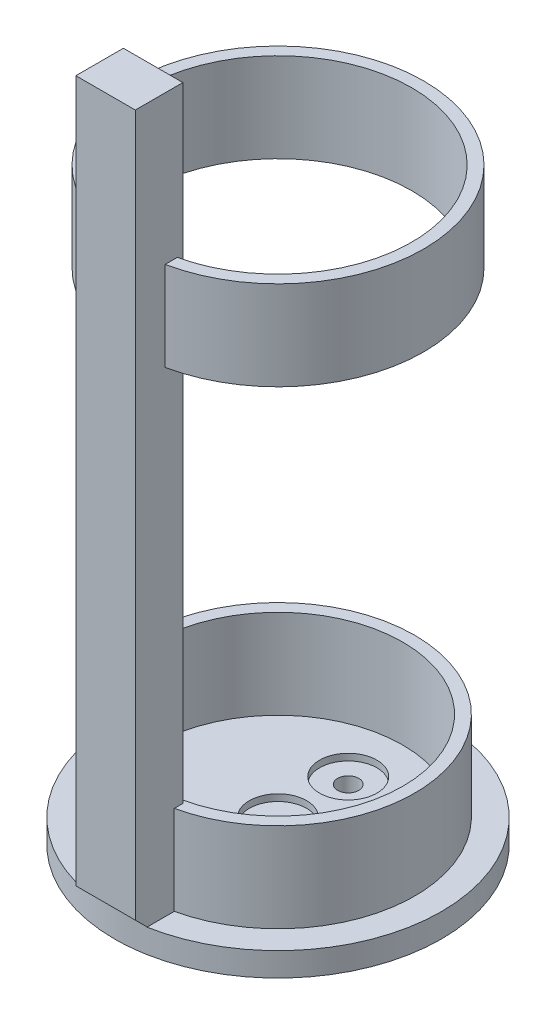
ISO-10303-21;
HEADER;
FILE_DESCRIPTION(('STEP AP214'),'2;1');
FILE_NAME('part.step','',(''),(''),'','','');
FILE_SCHEMA(('AUTOMOTIVE_DESIGN { 1 0 10303 214 1 1 1 1 }'));
ENDSEC;
DATA;
#1=APPLICATION_CONTEXT('core data for automotive mechanical design processes');
#2=APPLICATION_PROTOCOL_DEFINITION('international standard','automotive_design',2000,#1);
#3=PRODUCT_CONTEXT('',#1,'mechanical');
#4=PRODUCT('Part','Part','',(#3));
#5=PRODUCT_RELATED_PRODUCT_CATEGORY('part','',(#4));
#6=PRODUCT_DEFINITION_FORMATION('','',#4);
#7=PRODUCT_DEFINITION_CONTEXT('part definition',#1,'design');
#8=PRODUCT_DEFINITION('design','',#6,#7);
#9=PRODUCT_DEFINITION_SHAPE('','',#8);
#10=(LENGTH_UNIT() NAMED_UNIT(*) SI_UNIT(.MILLI.,.METRE.));
#11=(NAMED_UNIT(*) PLANE_ANGLE_UNIT() SI_UNIT($,.RADIAN.));
#12=(NAMED_UNIT(*) SI_UNIT($,.STERADIAN.) SOLID_ANGLE_UNIT());
#13=UNCERTAINTY_MEASURE_WITH_UNIT(LENGTH_MEASURE(1.E-05),#10,'distance_accuracy_value','');
#14=(GEOMETRIC_REPRESENTATION_CONTEXT(3) GLOBAL_UNCERTAINTY_ASSIGNED_CONTEXT((#13)) GLOBAL_UNIT_ASSIGNED_CONTEXT((#10,
#11,#12)) REPRESENTATION_CONTEXT('',''));
#15=CARTESIAN_POINT('',(0.,0.,0.));
#16=DIRECTION('',(0.,0.,1.));
#17=DIRECTION('',(1.,0.,0.));
#18=AXIS2_PLACEMENT_3D('',#15,#16,#17);
#19=CARTESIAN_POINT('',(-6.35000000000005,157.48,26.67));
#20=DIRECTION('',(1.,0.,0.));
#21=DIRECTION('',(0.,0.,-1.));
#22=AXIS2_PLACEMENT_3D('',#19,#20,#21);
#23=PLANE('',#22);
#24=DIRECTION('',(0.,0.,1.));
#25=VECTOR('',#24,1.);
#26=CARTESIAN_POINT('',(-6.35000000000005,5.08,26.67));
#27=LINE('',#26,#25);
#28=CARTESIAN_POINT('',(-6.35000000000005,5.08,28.5114292872174));
#29=VERTEX_POINT('',#28);
#30=CARTESIAN_POINT('',(-6.35000000000004,5.08,34.3428758987945));
#31=VERTEX_POINT('',#30);
#32=EDGE_CURVE('E242',#29,#31,#27,.T.);
#33=ORIENTED_EDGE('',*,*,#32,.T.);
#34=DIRECTION('',(0.,-1.,0.));
#35=VECTOR('',#34,1.);
#36=CARTESIAN_POINT('',(-6.35000000000004,5.08,34.3428758987945));
#37=LINE('',#36,#35);
#38=CARTESIAN_POINT('',(-6.35000000000005,5.13287589879451,34.3428758987945));
#39=VERTEX_POINT('',#38);
#40=EDGE_CURVE('E162',#39,#31,#37,.T.);
#41=ORIENTED_EDGE('',*,*,#40,.F.);
#42=DIRECTION('',(0.,-0.707106781186551,-0.707106781186545));
#43=VECTOR('',#42,1.);
#44=CARTESIAN_POINT('',(-6.35000000000005,7.62000000000004,36.83));
#45=LINE('',#44,#43);
#46=CARTESIAN_POINT('',(-6.35000000000005,7.6200000000001,36.83));
#47=VERTEX_POINT('',#46);
#48=EDGE_CURVE('E191',#39,#47,#45,.F.);
#49=ORIENTED_EDGE('',*,*,#48,.T.);
#50=DIRECTION('',(0.,-1.,0.));
#51=VECTOR('',#50,1.);
#52=CARTESIAN_POINT('',(-6.35000000000005,157.48,36.83));
#53=LINE('',#52,#51);
#54=CARTESIAN_POINT('',(-6.35000000000005,157.48,36.83));
#55=VERTEX_POINT('',#54);
#56=EDGE_CURVE('E221',#55,#47,#53,.T.);
#57=ORIENTED_EDGE('',*,*,#56,.F.);
#58=DIRECTION('',(0.,0.,1.));
#59=VECTOR('',#58,1.);
#60=CARTESIAN_POINT('',(-6.35000000000005,157.48,26.67));
#61=LINE('',#60,#59);
#62=CARTESIAN_POINT('',(-6.35000000000005,157.48,26.67));
#63=VERTEX_POINT('',#62);
#64=EDGE_CURVE('E246',#63,#55,#61,.T.);
#65=ORIENTED_EDGE('',*,*,#64,.F.);
#66=DIRECTION('',(0.,-1.,0.));
#67=VECTOR('',#66,1.);
#68=CARTESIAN_POINT('',(-6.35000000000005,157.48,26.67));
#69=LINE('',#68,#67);
#70=CARTESIAN_POINT('',(-6.35000000000005,24.1300000000001,26.67));
#71=VERTEX_POINT('',#70);
#72=EDGE_CURVE('E235',#63,#71,#69,.T.);
#73=ORIENTED_EDGE('',*,*,#72,.T.);
#74=DIRECTION('',(0.,0.,1.));
#75=VECTOR('',#74,1.);
#76=CARTESIAN_POINT('',(-6.35000000000005,24.13,26.67));
#77=LINE('',#76,#75);
#78=CARTESIAN_POINT('',(-6.35000000000005,24.13,28.5114292872174));
#79=VERTEX_POINT('',#78);
#80=EDGE_CURVE('E261',#71,#79,#77,.T.);
#81=ORIENTED_EDGE('',*,*,#80,.T.);
#82=DIRECTION('',(0.,-1.,0.));
#83=VECTOR('',#82,1.);
#84=CARTESIAN_POINT('',(-6.35000000000004,24.13,28.5114292872174));
#85=LINE('',#84,#83);
#86=EDGE_CURVE('E247',#29,#79,#85,.F.);
#87=ORIENTED_EDGE('',*,*,#86,.F.);
#88=EDGE_LOOP('',(#33,#41,#49,#57,#65,#73,#81,#87));
#89=FACE_BOUND('',#88,.T.);
#90=DIRECTION('',(0.,-1.,0.));
#91=VECTOR('',#90,1.);
#92=CARTESIAN_POINT('',(-6.35000000000004,125.73,30.4601497862371));
#93=LINE('',#92,#91);
#94=CARTESIAN_POINT('',(-6.35000000000004,106.68,30.4601497862371));
#95=VERTEX_POINT('',#94);
#96=CARTESIAN_POINT('',(-6.35000000000004,125.73,30.4601497862371));
#97=VERTEX_POINT('',#96);
#98=EDGE_CURVE('E333',#95,#97,#93,.F.);
#99=ORIENTED_EDGE('',*,*,#98,.F.);
#100=DIRECTION('',(0.,0.,1.));
#101=VECTOR('',#100,1.);
#102=CARTESIAN_POINT('',(-6.35000000000005,106.68,26.67));
#103=LINE('',#102,#101);
#104=CARTESIAN_POINT('',(-6.35000000000004,106.68,27.86051192997));
#105=VERTEX_POINT('',#104);
#106=EDGE_CURVE('E330',#105,#95,#103,.T.);
#107=ORIENTED_EDGE('',*,*,#106,.F.);
#108=DIRECTION('',(0.,-1.,0.));
#109=VECTOR('',#108,1.);
#110=CARTESIAN_POINT('',(-6.35000000000004,125.73,27.86051192997));
#111=LINE('',#110,#109);
#112=CARTESIAN_POINT('',(-6.35000000000004,125.73,27.86051192997));
#113=VERTEX_POINT('',#112);
#114=EDGE_CURVE('E336',#105,#113,#111,.F.);
#115=ORIENTED_EDGE('',*,*,#114,.T.);
#116=DIRECTION('',(0.,0.,1.));
#117=VECTOR('',#116,1.);
#118=CARTESIAN_POINT('',(-6.35000000000005,125.73,26.67));
#119=LINE('',#118,#117);
#120=EDGE_CURVE('E169',#113,#97,#119,.T.);
#121=ORIENTED_EDGE('',*,*,#120,.T.);
#122=EDGE_LOOP('',(#99,#107,#115,#121));
#123=FACE_BOUND('',#122,.T.);
#124=ADVANCED_FACE('F65',(#89,#123),#23,.F.);
#125=CARTESIAN_POINT('',(6.34999999999995,157.48,26.67));
#126=DIRECTION('',(-1.,0.,0.));
#127=DIRECTION('',(0.,0.,1.));
#128=AXIS2_PLACEMENT_3D('',#125,#126,#127);
#129=PLANE('',#128);
#130=DIRECTION('',(0.,-1.,0.));
#131=VECTOR('',#130,1.);
#132=CARTESIAN_POINT('',(6.35000000000005,157.48,36.83));
#133=LINE('',#132,#131);
#134=CARTESIAN_POINT('',(6.35000000000005,157.48,36.83));
#135=VERTEX_POINT('',#134);
#136=CARTESIAN_POINT('',(6.35000000000005,7.6200000000001,36.83));
#137=VERTEX_POINT('',#136);
#138=EDGE_CURVE('E227',#135,#137,#133,.T.);
#139=ORIENTED_EDGE('',*,*,#138,.T.);
#140=DIRECTION('',(0.,0.707106781186551,0.707106781186545));
#141=VECTOR('',#140,1.);
#142=CARTESIAN_POINT('',(6.35000000000005,7.61999999999998,36.8299999999999));
#143=LINE('',#142,#141);
#144=CARTESIAN_POINT('',(6.35000000000003,5.13287589879451,34.3428758987945));
#145=VERTEX_POINT('',#144);
#146=EDGE_CURVE('E194',#137,#145,#143,.F.);
#147=ORIENTED_EDGE('',*,*,#146,.T.);
#148=DIRECTION('',(0.,-1.,0.));
#149=VECTOR('',#148,1.);
#150=CARTESIAN_POINT('',(6.35000000000002,5.08,34.3428758987945));
#151=LINE('',#150,#149);
#152=CARTESIAN_POINT('',(6.35000000000003,5.08,34.3428758987945));
#153=VERTEX_POINT('',#152);
#154=EDGE_CURVE('E183',#145,#153,#151,.T.);
#155=ORIENTED_EDGE('',*,*,#154,.T.);
#156=DIRECTION('',(0.,0.,-1.));
#157=VECTOR('',#156,1.);
#158=CARTESIAN_POINT('',(6.34999999999995,5.08,26.67));
#159=LINE('',#158,#157);
#160=CARTESIAN_POINT('',(6.34999999999997,5.08,28.5114292872174));
#161=VERTEX_POINT('',#160);
#162=EDGE_CURVE('E215',#153,#161,#159,.T.);
#163=ORIENTED_EDGE('',*,*,#162,.T.);
#164=DIRECTION('',(0.,-1.,0.));
#165=VECTOR('',#164,1.);
#166=CARTESIAN_POINT('',(6.34999999999997,24.13,28.5114292872174));
#167=LINE('',#166,#165);
#168=CARTESIAN_POINT('',(6.34999999999997,24.13,28.5114292872174));
#169=VERTEX_POINT('',#168);
#170=EDGE_CURVE('E206',#169,#161,#167,.T.);
#171=ORIENTED_EDGE('',*,*,#170,.F.);
#172=DIRECTION('',(0.,0.,-1.));
#173=VECTOR('',#172,1.);
#174=CARTESIAN_POINT('',(6.34999999999995,24.13,26.67));
#175=LINE('',#174,#173);
#176=CARTESIAN_POINT('',(6.34999999999995,24.13,26.67));
#177=VERTEX_POINT('',#176);
#178=EDGE_CURVE('E265',#169,#177,#175,.T.);
#179=ORIENTED_EDGE('',*,*,#178,.T.);
#180=DIRECTION('',(0.,-1.,0.));
#181=VECTOR('',#180,1.);
#182=CARTESIAN_POINT('',(6.34999999999995,157.48,26.67));
#183=LINE('',#182,#181);
#184=CARTESIAN_POINT('',(6.34999999999995,157.48,26.67));
#185=VERTEX_POINT('',#184);
#186=EDGE_CURVE('E231',#185,#177,#183,.T.);
#187=ORIENTED_EDGE('',*,*,#186,.F.);
#188=DIRECTION('',(0.,0.,-1.));
#189=VECTOR('',#188,1.);
#190=CARTESIAN_POINT('',(6.34999999999995,157.48,26.67));
#191=LINE('',#190,#189);
#192=EDGE_CURVE('E250',#135,#185,#191,.T.);
#193=ORIENTED_EDGE('',*,*,#192,.F.);
#194=EDGE_LOOP('',(#139,#147,#155,#163,#171,#179,#187,#193));
#195=FACE_BOUND('',#194,.T.);
#196=DIRECTION('',(0.,-1.,0.));
#197=VECTOR('',#196,1.);
#198=CARTESIAN_POINT('',(6.34999999999999,125.73,30.4601497862371));
#199=LINE('',#198,#197);
#200=CARTESIAN_POINT('',(6.34999999999999,125.73,30.4601497862371));
#201=VERTEX_POINT('',#200);
#202=CARTESIAN_POINT('',(6.34999999999999,106.68,30.4601497862371));
#203=VERTEX_POINT('',#202);
#204=EDGE_CURVE('E13',#201,#203,#199,.T.);
#205=ORIENTED_EDGE('',*,*,#204,.F.);
#206=DIRECTION('',(0.,0.,-1.));
#207=VECTOR('',#206,1.);
#208=CARTESIAN_POINT('',(6.34999999999995,125.73,26.67));
#209=LINE('',#208,#207);
#210=CARTESIAN_POINT('',(6.34999999999997,125.73,27.86051192997));
#211=VERTEX_POINT('',#210);
#212=EDGE_CURVE('E75',#201,#211,#209,.T.);
#213=ORIENTED_EDGE('',*,*,#212,.T.);
#214=DIRECTION('',(0.,-1.,0.));
#215=VECTOR('',#214,1.);
#216=CARTESIAN_POINT('',(6.34999999999996,125.73,27.86051192997));
#217=LINE('',#216,#215);
#218=CARTESIAN_POINT('',(6.34999999999996,106.68,27.86051192997));
#219=VERTEX_POINT('',#218);
#220=EDGE_CURVE('E155',#211,#219,#217,.T.);
#221=ORIENTED_EDGE('',*,*,#220,.T.);
#222=DIRECTION('',(0.,0.,-1.));
#223=VECTOR('',#222,1.);
#224=CARTESIAN_POINT('',(6.34999999999995,106.68,26.67));
#225=LINE('',#224,#223);
#226=EDGE_CURVE('E161',#203,#219,#225,.T.);
#227=ORIENTED_EDGE('',*,*,#226,.F.);
#228=EDGE_LOOP('',(#205,#213,#221,#227));
#229=FACE_BOUND('',#228,.T.);
#230=ADVANCED_FACE('F175',(#195,#229),#129,.F.);
#231=CARTESIAN_POINT('',(0.,5.08,0.));
#232=DIRECTION('',(0.,-1.,0.));
#233=DIRECTION('',(0.,0.,-1.));
#234=AXIS2_PLACEMENT_3D('',#231,#232,#233);
#235=CYLINDRICAL_SURFACE('',#234,34.925);
#236=CARTESIAN_POINT('',(0.,5.08,0.));
#237=DIRECTION('',(0.,1.,0.));
#238=DIRECTION('',(0.,0.,1.));
#239=AXIS2_PLACEMENT_3D('',#236,#237,#238);
#240=CIRCLE('',#239,34.925);
#241=EDGE_CURVE('E220',#153,#31,#240,.T.);
#242=ORIENTED_EDGE('',*,*,#241,.F.);
#243=ORIENTED_EDGE('',*,*,#154,.F.);
#244=CARTESIAN_POINT('',(0.,-29.2100000000003,0.));
#245=DIRECTION('',(0.,0.707106781186545,-0.707106781186551));
#246=DIRECTION('',(0.,-0.707106781186551,-0.707106781186545));
#247=AXIS2_PLACEMENT_3D('',#244,#245,#246);
#248=ELLIPSE('',#247,49.3914086658805,34.925);
#249=EDGE_CURVE('E187',#145,#39,#248,.F.);
#250=ORIENTED_EDGE('',*,*,#249,.T.);
#251=ORIENTED_EDGE('',*,*,#40,.T.);
#252=EDGE_LOOP('',(#242,#243,#250,#251));
#253=FACE_BOUND('',#252,.T.);
#254=CARTESIAN_POINT('',(0.,0.,0.));
#255=DIRECTION('',(0.,1.,0.));
#256=DIRECTION('',(0.,0.,1.));
#257=AXIS2_PLACEMENT_3D('',#254,#255,#256);
#258=CIRCLE('',#257,34.925);
#259=CARTESIAN_POINT('',(0.,0.,34.925));
#260=VERTEX_POINT('',#259);
#261=EDGE_CURVE('E216',#260,#260,#258,.T.);
#262=ORIENTED_EDGE('',*,*,#261,.T.);
#263=EDGE_LOOP('',(#262));
#264=FACE_BOUND('',#263,.T.);
#265=ADVANCED_FACE('F369',(#253,#264),#235,.T.);
#266=CARTESIAN_POINT('',(0.,5.08,0.));
#267=DIRECTION('',(0.,1.,0.));
#268=DIRECTION('',(0.,0.,1.));
#269=AXIS2_PLACEMENT_3D('',#266,#267,#268);
#270=PLANE('',#269);
#271=ORIENTED_EDGE('',*,*,#162,.F.);
#272=ORIENTED_EDGE('',*,*,#241,.T.);
#273=ORIENTED_EDGE('',*,*,#32,.F.);
#274=CARTESIAN_POINT('',(0.,5.08,0.));
#275=DIRECTION('',(0.,1.,0.));
#276=DIRECTION('',(1.,0.,0.));
#277=AXIS2_PLACEMENT_3D('',#274,#275,#276);
#278=CIRCLE('',#277,29.21);
#279=EDGE_CURVE('E270',#161,#29,#278,.T.);
#280=ORIENTED_EDGE('',*,*,#279,.F.);
#281=EDGE_LOOP('',(#271,#272,#273,#280));
#282=FACE_BOUND('',#281,.T.);
#283=ADVANCED_FACE('F375',(#282),#270,.T.);
#284=CARTESIAN_POINT('',(0.,0.,0.));
#285=DIRECTION('',(0.,1.,0.));
#286=DIRECTION('',(0.,0.,1.));
#287=AXIS2_PLACEMENT_3D('',#284,#285,#286);
#288=PLANE('',#287);
#289=CARTESIAN_POINT('',(0.,0.,0.));
#290=DIRECTION('',(0.,-1.,0.));
#291=DIRECTION('',(0.,0.,-1.));
#292=AXIS2_PLACEMENT_3D('',#289,#290,#291);
#293=CIRCLE('',#292,2.25);
#294=CARTESIAN_POINT('',(0.,0.,-2.25));
#295=VERTEX_POINT('',#294);
#296=EDGE_CURVE('E312',#295,#295,#293,.T.);
#297=ORIENTED_EDGE('',*,*,#296,.F.);
#298=EDGE_LOOP('',(#297));
#299=FACE_BOUND('',#298,.T.);
#300=CARTESIAN_POINT('',(0.,0.,15.));
#301=DIRECTION('',(0.,-1.,0.));
#302=DIRECTION('',(0.,0.,-1.));
#303=AXIS2_PLACEMENT_3D('',#300,#301,#302);
#304=CIRCLE('',#303,2.25);
#305=CARTESIAN_POINT('',(0.,0.,12.75));
#306=VERTEX_POINT('',#305);
#307=EDGE_CURVE('E296',#306,#306,#304,.T.);
#308=ORIENTED_EDGE('',*,*,#307,.F.);
#309=EDGE_LOOP('',(#308));
#310=FACE_BOUND('',#309,.T.);
#311=CARTESIAN_POINT('',(0.,0.,-15.));
#312=DIRECTION('',(0.,-1.,0.));
#313=DIRECTION('',(0.,0.,-1.));
#314=AXIS2_PLACEMENT_3D('',#311,#312,#313);
#315=CIRCLE('',#314,2.25);
#316=CARTESIAN_POINT('',(0.,0.,-17.25));
#317=VERTEX_POINT('',#316);
#318=EDGE_CURVE('E280',#317,#317,#315,.T.);
#319=ORIENTED_EDGE('',*,*,#318,.F.);
#320=EDGE_LOOP('',(#319));
#321=FACE_BOUND('',#320,.T.);
#322=ORIENTED_EDGE('',*,*,#261,.F.);
#323=EDGE_LOOP('',(#322));
#324=FACE_BOUND('',#323,.T.);
#325=ADVANCED_FACE('F378',(#299,#310,#321,#324),#288,.F.);
#326=CARTESIAN_POINT('',(-6.35000000000005,157.48,36.83));
#327=DIRECTION('',(0.,0.,-1.));
#328=DIRECTION('',(-1.,0.,0.));
#329=AXIS2_PLACEMENT_3D('',#326,#327,#328);
#330=PLANE('',#329);
#331=ORIENTED_EDGE('',*,*,#56,.T.);
#332=DIRECTION('',(1.,0.,0.));
#333=VECTOR('',#332,1.);
#334=CARTESIAN_POINT('',(-6.35000000000005,7.62000000000004,36.83));
#335=LINE('',#334,#333);
#336=EDGE_CURVE('E198',#47,#137,#335,.T.);
#337=ORIENTED_EDGE('',*,*,#336,.T.);
#338=ORIENTED_EDGE('',*,*,#138,.F.);
#339=DIRECTION('',(1.,0.,0.));
#340=VECTOR('',#339,1.);
#341=CARTESIAN_POINT('',(-6.35000000000005,157.48,36.83));
#342=LINE('',#341,#340);
#343=EDGE_CURVE('E253',#55,#135,#342,.T.);
#344=ORIENTED_EDGE('',*,*,#343,.F.);
#345=EDGE_LOOP('',(#331,#337,#338,#344));
#346=FACE_BOUND('',#345,.T.);
#347=ADVANCED_FACE('F374',(#346),#330,.F.);
#348=CARTESIAN_POINT('',(-6.35000000000005,157.48,26.67));
#349=DIRECTION('',(0.,0.,1.));
#350=DIRECTION('',(1.,0.,0.));
#351=AXIS2_PLACEMENT_3D('',#348,#349,#350);
#352=PLANE('',#351);
#353=ORIENTED_EDGE('',*,*,#186,.T.);
#354=DIRECTION('',(-1.,0.,0.));
#355=VECTOR('',#354,1.);
#356=CARTESIAN_POINT('',(-6.35000000000005,24.13,26.67));
#357=LINE('',#356,#355);
#358=CARTESIAN_POINT('',(0.,24.13,26.67));
#359=VERTEX_POINT('',#358);
#360=EDGE_CURVE('E210',#177,#359,#357,.T.);
#361=ORIENTED_EDGE('',*,*,#360,.T.);
#362=EDGE_CURVE('E211',#359,#71,#357,.T.);
#363=ORIENTED_EDGE('',*,*,#362,.T.);
#364=ORIENTED_EDGE('',*,*,#72,.F.);
#365=DIRECTION('',(-1.,0.,0.));
#366=VECTOR('',#365,1.);
#367=CARTESIAN_POINT('',(-6.35000000000005,157.48,26.67));
#368=LINE('',#367,#366);
#369=EDGE_CURVE('E239',#185,#63,#368,.T.);
#370=ORIENTED_EDGE('',*,*,#369,.F.);
#371=EDGE_LOOP('',(#353,#361,#363,#364,#370));
#372=FACE_BOUND('',#371,.T.);
#373=ADVANCED_FACE('F408',(#372),#352,.F.);
#374=CARTESIAN_POINT('',(0.,157.48,0.));
#375=DIRECTION('',(0.,1.,0.));
#376=DIRECTION('',(0.,0.,1.));
#377=AXIS2_PLACEMENT_3D('',#374,#375,#376);
#378=PLANE('',#377);
#379=ORIENTED_EDGE('',*,*,#64,.T.);
#380=ORIENTED_EDGE('',*,*,#343,.T.);
#381=ORIENTED_EDGE('',*,*,#192,.T.);
#382=ORIENTED_EDGE('',*,*,#369,.T.);
#383=EDGE_LOOP('',(#379,#380,#381,#382));
#384=FACE_BOUND('',#383,.T.);
#385=ADVANCED_FACE('F403',(#384),#378,.T.);
#386=CARTESIAN_POINT('',(0.,24.13,0.));
#387=DIRECTION('',(0.,-1.,0.));
#388=DIRECTION('',(0.,0.,-1.));
#389=AXIS2_PLACEMENT_3D('',#386,#387,#388);
#390=CYLINDRICAL_SURFACE('',#389,29.21);
#391=ORIENTED_EDGE('',*,*,#279,.T.);
#392=ORIENTED_EDGE('',*,*,#86,.T.);
#393=CARTESIAN_POINT('',(0.,24.13,0.));
#394=DIRECTION('',(0.,1.,0.));
#395=DIRECTION('',(1.,0.,0.));
#396=AXIS2_PLACEMENT_3D('',#393,#394,#395);
#397=CIRCLE('',#396,29.21);
#398=EDGE_CURVE('E269',#169,#79,#397,.T.);
#399=ORIENTED_EDGE('',*,*,#398,.F.);
#400=ORIENTED_EDGE('',*,*,#170,.T.);
#401=EDGE_LOOP('',(#391,#392,#399,#400));
#402=FACE_BOUND('',#401,.T.);
#403=ADVANCED_FACE('F455',(#402),#390,.T.);
#404=CARTESIAN_POINT('',(0.,24.13,0.));
#405=DIRECTION('',(0.,1.,0.));
#406=DIRECTION('',(0.,0.,1.));
#407=AXIS2_PLACEMENT_3D('',#404,#405,#406);
#408=PLANE('',#407);
#409=ORIENTED_EDGE('',*,*,#80,.F.);
#410=ORIENTED_EDGE('',*,*,#362,.F.);
#411=CARTESIAN_POINT('',(0.,24.13,0.));
#412=DIRECTION('',(0.,1.,0.));
#413=DIRECTION('',(0.,0.,1.));
#414=AXIS2_PLACEMENT_3D('',#411,#412,#413);
#415=CIRCLE('',#414,26.67);
#416=EDGE_CURVE('E273',#359,#359,#415,.T.);
#417=ORIENTED_EDGE('',*,*,#416,.F.);
#418=ORIENTED_EDGE('',*,*,#360,.F.);
#419=ORIENTED_EDGE('',*,*,#178,.F.);
#420=ORIENTED_EDGE('',*,*,#398,.T.);
#421=EDGE_LOOP('',(#409,#410,#417,#418,#419,#420));
#422=FACE_BOUND('',#421,.T.);
#423=ADVANCED_FACE('F412',(#422),#408,.T.);
#424=CARTESIAN_POINT('',(0.,24.13,0.));
#425=DIRECTION('',(0.,-1.,0.));
#426=DIRECTION('',(0.,0.,-1.));
#427=AXIS2_PLACEMENT_3D('',#424,#425,#426);
#428=CYLINDRICAL_SURFACE('',#427,26.67);
#429=ORIENTED_EDGE('',*,*,#416,.T.);
#430=EDGE_LOOP('',(#429));
#431=FACE_BOUND('',#430,.T.);
#432=CARTESIAN_POINT('',(0.,5.08,0.));
#433=DIRECTION('',(0.,1.,0.));
#434=DIRECTION('',(0.,0.,1.));
#435=AXIS2_PLACEMENT_3D('',#432,#433,#434);
#436=CIRCLE('',#435,26.67);
#437=CARTESIAN_POINT('',(0.,5.08,26.67));
#438=VERTEX_POINT('',#437);
#439=EDGE_CURVE('E202',#438,#438,#436,.F.);
#440=ORIENTED_EDGE('',*,*,#439,.T.);
#441=EDGE_LOOP('',(#440));
#442=FACE_BOUND('',#441,.T.);
#443=ADVANCED_FACE('F414',(#431,#442),#428,.F.);
#444=CARTESIAN_POINT('',(0.,5.08,0.));
#445=DIRECTION('',(0.,-1.,0.));
#446=DIRECTION('',(0.,0.,-1.));
#447=AXIS2_PLACEMENT_3D('',#444,#445,#446);
#448=CIRCLE('',#447,6.12);
#449=CARTESIAN_POINT('',(0.,5.08,-6.12));
#450=VERTEX_POINT('',#449);
#451=EDGE_CURVE('E324',#450,#450,#448,.T.);
#452=ORIENTED_EDGE('',*,*,#451,.T.);
#453=EDGE_LOOP('',(#452));
#454=FACE_BOUND('',#453,.T.);
#455=CARTESIAN_POINT('',(0.,5.08,15.));
#456=DIRECTION('',(0.,-1.,0.));
#457=DIRECTION('',(0.,0.,-1.));
#458=AXIS2_PLACEMENT_3D('',#455,#456,#457);
#459=CIRCLE('',#458,6.12);
#460=CARTESIAN_POINT('',(0.,5.08,8.88));
#461=VERTEX_POINT('',#460);
#462=EDGE_CURVE('E308',#461,#461,#459,.T.);
#463=ORIENTED_EDGE('',*,*,#462,.T.);
#464=EDGE_LOOP('',(#463));
#465=FACE_BOUND('',#464,.T.);
#466=CARTESIAN_POINT('',(0.,5.08,-15.));
#467=DIRECTION('',(0.,-1.,0.));
#468=DIRECTION('',(0.,0.,-1.));
#469=AXIS2_PLACEMENT_3D('',#466,#467,#468);
#470=CIRCLE('',#469,6.12);
#471=CARTESIAN_POINT('',(0.,5.08,-21.12));
#472=VERTEX_POINT('',#471);
#473=EDGE_CURVE('E292',#472,#472,#470,.T.);
#474=ORIENTED_EDGE('',*,*,#473,.T.);
#475=EDGE_LOOP('',(#474));
#476=FACE_BOUND('',#475,.T.);
#477=ORIENTED_EDGE('',*,*,#439,.F.);
#478=EDGE_LOOP('',(#477));
#479=FACE_BOUND('',#478,.T.);
#480=ADVANCED_FACE('F380',(#454,#465,#476,#479),#270,.T.);
#481=CARTESIAN_POINT('',(0.,0.,-15.));
#482=DIRECTION('',(0.,-1.,0.));
#483=DIRECTION('',(0.,0.,-1.));
#484=AXIS2_PLACEMENT_3D('',#481,#482,#483);
#485=CYLINDRICAL_SURFACE('',#484,2.25);
#486=CARTESIAN_POINT('',(0.,3.65,-15.));
#487=DIRECTION('',(0.,-1.,0.));
#488=DIRECTION('',(0.,0.,-1.));
#489=AXIS2_PLACEMENT_3D('',#486,#487,#488);
#490=CIRCLE('',#489,2.25);
#491=CARTESIAN_POINT('',(0.,3.65,-17.25));
#492=VERTEX_POINT('',#491);
#493=EDGE_CURVE('E284',#492,#492,#490,.T.);
#494=ORIENTED_EDGE('',*,*,#493,.F.);
#495=EDGE_LOOP('',(#494));
#496=FACE_BOUND('',#495,.T.);
#497=ORIENTED_EDGE('',*,*,#318,.T.);
#498=EDGE_LOOP('',(#497));
#499=FACE_BOUND('',#498,.T.);
#500=ADVANCED_FACE('F421',(#496,#499),#485,.F.);
#501=CARTESIAN_POINT('',(6.12,3.65,-15.));
#502=DIRECTION('',(0.,-1.,0.));
#503=DIRECTION('',(0.,0.,-1.));
#504=AXIS2_PLACEMENT_3D('',#501,#502,#503);
#505=PLANE('',#504);
#506=CARTESIAN_POINT('',(0.,3.65,-15.));
#507=DIRECTION('',(0.,-1.,0.));
#508=DIRECTION('',(0.,0.,-1.));
#509=AXIS2_PLACEMENT_3D('',#506,#507,#508);
#510=CIRCLE('',#509,6.12);
#511=CARTESIAN_POINT('',(0.,3.65,-21.12));
#512=VERTEX_POINT('',#511);
#513=EDGE_CURVE('E288',#512,#512,#510,.T.);
#514=ORIENTED_EDGE('',*,*,#513,.F.);
#515=EDGE_LOOP('',(#514));
#516=FACE_BOUND('',#515,.T.);
#517=ORIENTED_EDGE('',*,*,#493,.T.);
#518=EDGE_LOOP('',(#517));
#519=FACE_BOUND('',#518,.T.);
#520=ADVANCED_FACE('F426',(#516,#519),#505,.F.);
#521=CARTESIAN_POINT('',(0.,0.,-15.));
#522=DIRECTION('',(0.,-1.,0.));
#523=DIRECTION('',(0.,0.,-1.));
#524=AXIS2_PLACEMENT_3D('',#521,#522,#523);
#525=CYLINDRICAL_SURFACE('',#524,6.12);
#526=ORIENTED_EDGE('',*,*,#473,.F.);
#527=EDGE_LOOP('',(#526));
#528=FACE_BOUND('',#527,.T.);
#529=ORIENTED_EDGE('',*,*,#513,.T.);
#530=EDGE_LOOP('',(#529));
#531=FACE_BOUND('',#530,.T.);
#532=ADVANCED_FACE('F435',(#528,#531),#525,.F.);
#533=CARTESIAN_POINT('',(0.,0.,15.));
#534=DIRECTION('',(0.,-1.,0.));
#535=DIRECTION('',(0.,0.,-1.));
#536=AXIS2_PLACEMENT_3D('',#533,#534,#535);
#537=CYLINDRICAL_SURFACE('',#536,2.25);
#538=CARTESIAN_POINT('',(0.,3.65,15.));
#539=DIRECTION('',(0.,-1.,0.));
#540=DIRECTION('',(0.,0.,-1.));
#541=AXIS2_PLACEMENT_3D('',#538,#539,#540);
#542=CIRCLE('',#541,2.25);
#543=CARTESIAN_POINT('',(0.,3.65,12.75));
#544=VERTEX_POINT('',#543);
#545=EDGE_CURVE('E300',#544,#544,#542,.T.);
#546=ORIENTED_EDGE('',*,*,#545,.F.);
#547=EDGE_LOOP('',(#546));
#548=FACE_BOUND('',#547,.T.);
#549=ORIENTED_EDGE('',*,*,#307,.T.);
#550=EDGE_LOOP('',(#549));
#551=FACE_BOUND('',#550,.T.);
#552=ADVANCED_FACE('F438',(#548,#551),#537,.F.);
#553=CARTESIAN_POINT('',(6.12,3.65,15.));
#554=DIRECTION('',(0.,-1.,0.));
#555=DIRECTION('',(0.,0.,-1.));
#556=AXIS2_PLACEMENT_3D('',#553,#554,#555);
#557=PLANE('',#556);
#558=CARTESIAN_POINT('',(0.,3.65,15.));
#559=DIRECTION('',(0.,-1.,0.));
#560=DIRECTION('',(0.,0.,-1.));
#561=AXIS2_PLACEMENT_3D('',#558,#559,#560);
#562=CIRCLE('',#561,6.12);
#563=CARTESIAN_POINT('',(0.,3.65,8.88));
#564=VERTEX_POINT('',#563);
#565=EDGE_CURVE('E304',#564,#564,#562,.T.);
#566=ORIENTED_EDGE('',*,*,#565,.F.);
#567=EDGE_LOOP('',(#566));
#568=FACE_BOUND('',#567,.T.);
#569=ORIENTED_EDGE('',*,*,#545,.T.);
#570=EDGE_LOOP('',(#569));
#571=FACE_BOUND('',#570,.T.);
#572=ADVANCED_FACE('F525',(#568,#571),#557,.F.);
#573=CARTESIAN_POINT('',(0.,0.,15.));
#574=DIRECTION('',(0.,-1.,0.));
#575=DIRECTION('',(0.,0.,-1.));
#576=AXIS2_PLACEMENT_3D('',#573,#574,#575);
#577=CYLINDRICAL_SURFACE('',#576,6.12);
#578=ORIENTED_EDGE('',*,*,#462,.F.);
#579=EDGE_LOOP('',(#578));
#580=FACE_BOUND('',#579,.T.);
#581=ORIENTED_EDGE('',*,*,#565,.T.);
#582=EDGE_LOOP('',(#581));
#583=FACE_BOUND('',#582,.T.);
#584=ADVANCED_FACE('F514',(#580,#583),#577,.F.);
#585=CARTESIAN_POINT('',(0.,0.,0.));
#586=DIRECTION('',(0.,-1.,0.));
#587=DIRECTION('',(0.,0.,-1.));
#588=AXIS2_PLACEMENT_3D('',#585,#586,#587);
#589=CYLINDRICAL_SURFACE('',#588,2.25);
#590=CARTESIAN_POINT('',(0.,3.65,0.));
#591=DIRECTION('',(0.,-1.,0.));
#592=DIRECTION('',(0.,0.,-1.));
#593=AXIS2_PLACEMENT_3D('',#590,#591,#592);
#594=CIRCLE('',#593,2.25);
#595=CARTESIAN_POINT('',(0.,3.65,-2.25));
#596=VERTEX_POINT('',#595);
#597=EDGE_CURVE('E316',#596,#596,#594,.T.);
#598=ORIENTED_EDGE('',*,*,#597,.F.);
#599=EDGE_LOOP('',(#598));
#600=FACE_BOUND('',#599,.T.);
#601=ORIENTED_EDGE('',*,*,#296,.T.);
#602=EDGE_LOOP('',(#601));
#603=FACE_BOUND('',#602,.T.);
#604=ADVANCED_FACE('F503',(#600,#603),#589,.F.);
#605=CARTESIAN_POINT('',(6.12,3.65,0.));
#606=DIRECTION('',(0.,-1.,0.));
#607=DIRECTION('',(0.,0.,-1.));
#608=AXIS2_PLACEMENT_3D('',#605,#606,#607);
#609=PLANE('',#608);
#610=CARTESIAN_POINT('',(0.,3.65,0.));
#611=DIRECTION('',(0.,-1.,0.));
#612=DIRECTION('',(0.,0.,-1.));
#613=AXIS2_PLACEMENT_3D('',#610,#611,#612);
#614=CIRCLE('',#613,6.12);
#615=CARTESIAN_POINT('',(0.,3.65,-6.12));
#616=VERTEX_POINT('',#615);
#617=EDGE_CURVE('E320',#616,#616,#614,.T.);
#618=ORIENTED_EDGE('',*,*,#617,.F.);
#619=EDGE_LOOP('',(#618));
#620=FACE_BOUND('',#619,.T.);
#621=ORIENTED_EDGE('',*,*,#597,.T.);
#622=EDGE_LOOP('',(#621));
#623=FACE_BOUND('',#622,.T.);
#624=ADVANCED_FACE('F491',(#620,#623),#609,.F.);
#625=CARTESIAN_POINT('',(0.,0.,0.));
#626=DIRECTION('',(0.,-1.,0.));
#627=DIRECTION('',(0.,0.,-1.));
#628=AXIS2_PLACEMENT_3D('',#625,#626,#627);
#629=CYLINDRICAL_SURFACE('',#628,6.12);
#630=ORIENTED_EDGE('',*,*,#451,.F.);
#631=EDGE_LOOP('',(#630));
#632=FACE_BOUND('',#631,.T.);
#633=ORIENTED_EDGE('',*,*,#617,.T.);
#634=EDGE_LOOP('',(#633));
#635=FACE_BOUND('',#634,.T.);
#636=ADVANCED_FACE('F486',(#632,#635),#629,.F.);
#637=CARTESIAN_POINT('',(-6.35000000000005,7.62000000000004,36.83));
#638=DIRECTION('',(0.,0.707106781186545,-0.707106781186551));
#639=DIRECTION('',(1.,0.,0.));
#640=AXIS2_PLACEMENT_3D('',#637,#638,#639);
#641=PLANE('',#640);
#642=ORIENTED_EDGE('',*,*,#48,.F.);
#643=ORIENTED_EDGE('',*,*,#249,.F.);
#644=ORIENTED_EDGE('',*,*,#146,.F.);
#645=ORIENTED_EDGE('',*,*,#336,.F.);
#646=EDGE_LOOP('',(#642,#643,#644,#645));
#647=FACE_BOUND('',#646,.T.);
#648=ADVANCED_FACE('F68',(#647),#641,.F.);
#649=CARTESIAN_POINT('',(0.,125.73,0.));
#650=DIRECTION('',(0.,1.,0.));
#651=DIRECTION('',(-1.,0.,0.));
#652=AXIS2_PLACEMENT_3D('',#649,#650,#651);
#653=PLANE('',#652);
#654=ORIENTED_EDGE('',*,*,#120,.F.);
#655=CARTESIAN_POINT('',(0.,125.73,0.));
#656=DIRECTION('',(0.,1.,0.));
#657=DIRECTION('',(-1.,0.,0.));
#658=AXIS2_PLACEMENT_3D('',#655,#656,#657);
#659=CIRCLE('',#658,28.575);
#660=EDGE_CURVE('E82',#211,#113,#659,.T.);
#661=ORIENTED_EDGE('',*,*,#660,.F.);
#662=ORIENTED_EDGE('',*,*,#212,.F.);
#663=CARTESIAN_POINT('',(0.,125.73,0.));
#664=DIRECTION('',(0.,1.,0.));
#665=DIRECTION('',(-1.,0.,0.));
#666=AXIS2_PLACEMENT_3D('',#663,#664,#665);
#667=CIRCLE('',#666,31.115);
#668=EDGE_CURVE('E339',#201,#97,#667,.T.);
#669=ORIENTED_EDGE('',*,*,#668,.T.);
#670=EDGE_LOOP('',(#654,#661,#662,#669));
#671=FACE_BOUND('',#670,.T.);
#672=ADVANCED_FACE('F165',(#671),#653,.T.);
#673=CARTESIAN_POINT('',(0.,106.68,0.));
#674=DIRECTION('',(0.,1.,0.));
#675=DIRECTION('',(-1.,0.,0.));
#676=AXIS2_PLACEMENT_3D('',#673,#674,#675);
#677=PLANE('',#676);
#678=CARTESIAN_POINT('',(0.,106.68,0.));
#679=DIRECTION('',(0.,1.,0.));
#680=DIRECTION('',(-1.,0.,0.));
#681=AXIS2_PLACEMENT_3D('',#678,#679,#680);
#682=CIRCLE('',#681,28.575);
#683=EDGE_CURVE('E87',#219,#105,#682,.T.);
#684=ORIENTED_EDGE('',*,*,#683,.T.);
#685=ORIENTED_EDGE('',*,*,#106,.T.);
#686=CARTESIAN_POINT('',(0.,106.68,0.));
#687=DIRECTION('',(0.,1.,0.));
#688=DIRECTION('',(-1.,0.,0.));
#689=AXIS2_PLACEMENT_3D('',#686,#687,#688);
#690=CIRCLE('',#689,31.115);
#691=EDGE_CURVE('E172',#203,#95,#690,.T.);
#692=ORIENTED_EDGE('',*,*,#691,.F.);
#693=ORIENTED_EDGE('',*,*,#226,.T.);
#694=EDGE_LOOP('',(#684,#685,#692,#693));
#695=FACE_BOUND('',#694,.T.);
#696=ADVANCED_FACE('F348',(#695),#677,.F.);
#697=CARTESIAN_POINT('',(0.,125.73,0.));
#698=DIRECTION('',(0.,-1.,0.));
#699=DIRECTION('',(1.,0.,0.));
#700=AXIS2_PLACEMENT_3D('',#697,#698,#699);
#701=CYLINDRICAL_SURFACE('',#700,31.115);
#702=ORIENTED_EDGE('',*,*,#691,.T.);
#703=ORIENTED_EDGE('',*,*,#98,.T.);
#704=ORIENTED_EDGE('',*,*,#668,.F.);
#705=ORIENTED_EDGE('',*,*,#204,.T.);
#706=EDGE_LOOP('',(#702,#703,#704,#705));
#707=FACE_BOUND('',#706,.T.);
#708=ADVANCED_FACE('F353',(#707),#701,.T.);
#709=CARTESIAN_POINT('',(0.,125.73,0.));
#710=DIRECTION('',(0.,-1.,0.));
#711=DIRECTION('',(1.,0.,0.));
#712=AXIS2_PLACEMENT_3D('',#709,#710,#711);
#713=CYLINDRICAL_SURFACE('',#712,28.575);
#714=ORIENTED_EDGE('',*,*,#114,.F.);
#715=ORIENTED_EDGE('',*,*,#683,.F.);
#716=ORIENTED_EDGE('',*,*,#220,.F.);
#717=ORIENTED_EDGE('',*,*,#660,.T.);
#718=EDGE_LOOP('',(#714,#715,#716,#717));
#719=FACE_BOUND('',#718,.T.);
#720=ADVANCED_FACE('F156',(#719),#713,.F.);
#721=CLOSED_SHELL('',(#124,#230,#265,#283,#325,#347,#373,#385,#403,#423,#443,#480,#500,#520,
#532,#552,#572,#584,#604,#624,#636,#648,#672,#696,#708,#720));
#722=MANIFOLD_SOLID_BREP('B2',#721);
#723=ADVANCED_BREP_SHAPE_REPRESENTATION('',(#18,#722),#14);
#724=SHAPE_DEFINITION_REPRESENTATION(#9,#723);
ENDSEC;
END-ISO-10303-21;
